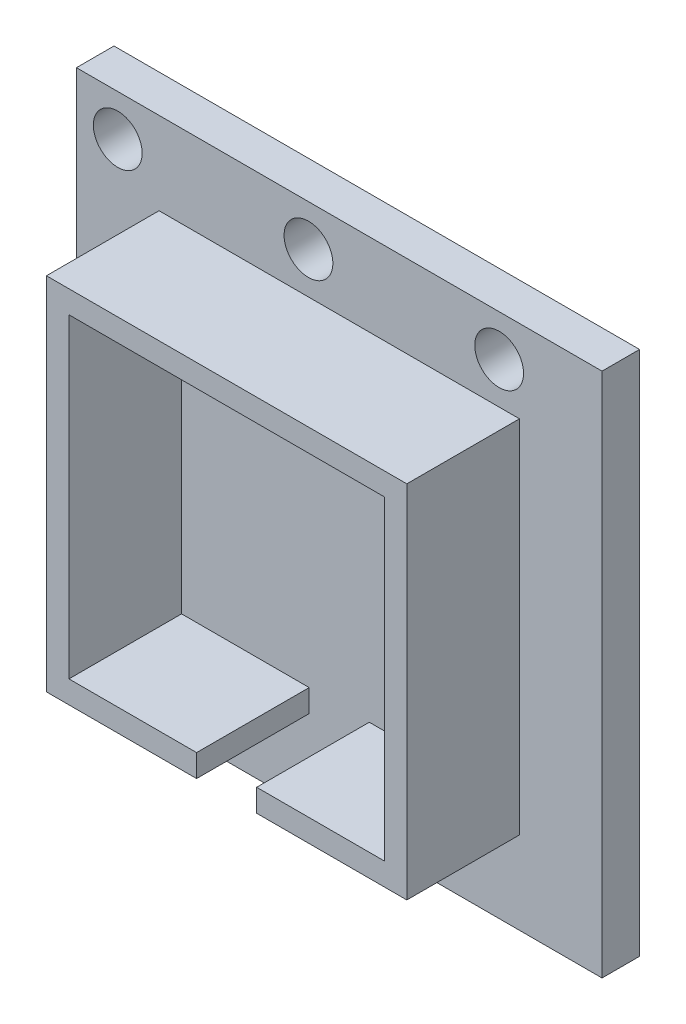
ISO-10303-21;
HEADER;
FILE_DESCRIPTION(('STEP AP214'),'2;1');
FILE_NAME('part.step','',(''),(''),'','','');
FILE_SCHEMA(('AUTOMOTIVE_DESIGN { 1 0 10303 214 1 1 1 1 }'));
ENDSEC;
DATA;
#1=APPLICATION_CONTEXT('core data for automotive mechanical design processes');
#2=APPLICATION_PROTOCOL_DEFINITION('international standard','automotive_design',2000,#1);
#3=PRODUCT_CONTEXT('',#1,'mechanical');
#4=PRODUCT('Part','Part','',(#3));
#5=PRODUCT_RELATED_PRODUCT_CATEGORY('part','',(#4));
#6=PRODUCT_DEFINITION_FORMATION('','',#4);
#7=PRODUCT_DEFINITION_CONTEXT('part definition',#1,'design');
#8=PRODUCT_DEFINITION('design','',#6,#7);
#9=PRODUCT_DEFINITION_SHAPE('','',#8);
#10=(LENGTH_UNIT() NAMED_UNIT(*) SI_UNIT(.MILLI.,.METRE.));
#11=(NAMED_UNIT(*) PLANE_ANGLE_UNIT() SI_UNIT($,.RADIAN.));
#12=(NAMED_UNIT(*) SI_UNIT($,.STERADIAN.) SOLID_ANGLE_UNIT());
#13=UNCERTAINTY_MEASURE_WITH_UNIT(LENGTH_MEASURE(1.E-05),#10,'distance_accuracy_value','');
#14=(GEOMETRIC_REPRESENTATION_CONTEXT(3) GLOBAL_UNCERTAINTY_ASSIGNED_CONTEXT((#13)) GLOBAL_UNIT_ASSIGNED_CONTEXT((#10,
#11,#12)) REPRESENTATION_CONTEXT('',''));
#15=CARTESIAN_POINT('',(0.,0.,0.));
#16=DIRECTION('',(0.,0.,1.));
#17=DIRECTION('',(1.,0.,0.));
#18=AXIS2_PLACEMENT_3D('',#15,#16,#17);
#19=CARTESIAN_POINT('',(11.,11.,20.));
#20=DIRECTION('',(0.,1.,0.));
#21=DIRECTION('',(0.,0.,1.));
#22=AXIS2_PLACEMENT_3D('',#19,#20,#21);
#23=PLANE('',#22);
#24=DIRECTION('',(1.,0.,0.));
#25=VECTOR('',#24,1.);
#26=CARTESIAN_POINT('',(11.,11.,5.));
#27=LINE('',#26,#25);
#28=CARTESIAN_POINT('',(11.,11.,5.));
#29=VERTEX_POINT('',#28);
#30=CARTESIAN_POINT('',(31.,11.,5.));
#31=VERTEX_POINT('',#30);
#32=EDGE_CURVE('E61',#29,#31,#27,.T.);
#33=ORIENTED_EDGE('',*,*,#32,.T.);
#34=DIRECTION('',(0.,0.,1.));
#35=VECTOR('',#34,1.);
#36=CARTESIAN_POINT('',(31.,11.,20.));
#37=LINE('',#36,#35);
#38=CARTESIAN_POINT('',(31.,11.,20.));
#39=VERTEX_POINT('',#38);
#40=EDGE_CURVE('E468',#31,#39,#37,.T.);
#41=ORIENTED_EDGE('',*,*,#40,.T.);
#42=DIRECTION('',(1.,0.,0.));
#43=VECTOR('',#42,1.);
#44=CARTESIAN_POINT('',(11.,11.,20.));
#45=LINE('',#44,#43);
#46=CARTESIAN_POINT('',(11.,11.,20.));
#47=VERTEX_POINT('',#46);
#48=EDGE_CURVE('E176',#47,#39,#45,.T.);
#49=ORIENTED_EDGE('',*,*,#48,.F.);
#50=DIRECTION('',(0.,0.,-1.));
#51=VECTOR('',#50,1.);
#52=CARTESIAN_POINT('',(11.,11.,20.));
#53=LINE('',#52,#51);
#54=EDGE_CURVE('E206',#47,#29,#53,.T.);
#55=ORIENTED_EDGE('',*,*,#54,.T.);
#56=EDGE_LOOP('',(#33,#41,#49,#55));
#57=FACE_BOUND('',#56,.T.);
#58=ADVANCED_FACE('F39',(#57),#23,.F.);
#59=CARTESIAN_POINT('',(14.,14.,20.));
#60=DIRECTION('',(0.,1.,0.));
#61=DIRECTION('',(0.,0.,1.));
#62=AXIS2_PLACEMENT_3D('',#59,#60,#61);
#63=PLANE('',#62);
#64=DIRECTION('',(0.,0.,1.));
#65=VECTOR('',#64,1.);
#66=CARTESIAN_POINT('',(31.,14.,20.));
#67=LINE('',#66,#65);
#68=CARTESIAN_POINT('',(31.,14.,5.));
#69=VERTEX_POINT('',#68);
#70=CARTESIAN_POINT('',(31.,14.,20.));
#71=VERTEX_POINT('',#70);
#72=EDGE_CURVE('E158',#69,#71,#67,.T.);
#73=ORIENTED_EDGE('',*,*,#72,.F.);
#74=DIRECTION('',(1.,0.,0.));
#75=VECTOR('',#74,1.);
#76=CARTESIAN_POINT('',(14.,14.,5.));
#77=LINE('',#76,#75);
#78=CARTESIAN_POINT('',(14.,14.,5.));
#79=VERTEX_POINT('',#78);
#80=EDGE_CURVE('E446',#79,#69,#77,.T.);
#81=ORIENTED_EDGE('',*,*,#80,.F.);
#82=DIRECTION('',(0.,0.,-1.));
#83=VECTOR('',#82,1.);
#84=CARTESIAN_POINT('',(14.,14.,20.));
#85=LINE('',#84,#83);
#86=CARTESIAN_POINT('',(14.,14.,20.));
#87=VERTEX_POINT('',#86);
#88=EDGE_CURVE('E193',#87,#79,#85,.T.);
#89=ORIENTED_EDGE('',*,*,#88,.F.);
#90=DIRECTION('',(1.,0.,0.));
#91=VECTOR('',#90,1.);
#92=CARTESIAN_POINT('',(14.,14.,20.));
#93=LINE('',#92,#91);
#94=EDGE_CURVE('E434',#87,#71,#93,.T.);
#95=ORIENTED_EDGE('',*,*,#94,.T.);
#96=EDGE_LOOP('',(#73,#81,#89,#95));
#97=FACE_BOUND('',#96,.T.);
#98=ADVANCED_FACE('F259',(#97),#63,.T.);
#99=CARTESIAN_POINT('',(0.,0.,5.));
#100=DIRECTION('',(1.,0.,0.));
#101=DIRECTION('',(0.,1.,0.));
#102=AXIS2_PLACEMENT_3D('',#99,#100,#101);
#103=PLANE('',#102);
#104=DIRECTION('',(0.,-1.,0.));
#105=VECTOR('',#104,1.);
#106=CARTESIAN_POINT('',(0.,0.,0.));
#107=LINE('',#106,#105);
#108=CARTESIAN_POINT('',(0.,70.,0.));
#109=VERTEX_POINT('',#108);
#110=CARTESIAN_POINT('',(0.,0.,0.));
#111=VERTEX_POINT('',#110);
#112=EDGE_CURVE('E208',#109,#111,#107,.T.);
#113=ORIENTED_EDGE('',*,*,#112,.T.);
#114=DIRECTION('',(0.,0.,-1.));
#115=VECTOR('',#114,1.);
#116=CARTESIAN_POINT('',(0.,0.,5.));
#117=LINE('',#116,#115);
#118=CARTESIAN_POINT('',(0.,0.,5.));
#119=VERTEX_POINT('',#118);
#120=EDGE_CURVE('E11',#119,#111,#117,.T.);
#121=ORIENTED_EDGE('',*,*,#120,.F.);
#122=DIRECTION('',(0.,-1.,0.));
#123=VECTOR('',#122,1.);
#124=CARTESIAN_POINT('',(0.,0.,5.));
#125=LINE('',#124,#123);
#126=CARTESIAN_POINT('',(0.,70.,5.));
#127=VERTEX_POINT('',#126);
#128=EDGE_CURVE('E217',#127,#119,#125,.T.);
#129=ORIENTED_EDGE('',*,*,#128,.F.);
#130=DIRECTION('',(0.,0.,-1.));
#131=VECTOR('',#130,1.);
#132=CARTESIAN_POINT('',(0.,70.,5.));
#133=LINE('',#132,#131);
#134=EDGE_CURVE('E226',#127,#109,#133,.T.);
#135=ORIENTED_EDGE('',*,*,#134,.T.);
#136=EDGE_LOOP('',(#113,#121,#129,#135));
#137=FACE_BOUND('',#136,.T.);
#138=ADVANCED_FACE('F41',(#137),#103,.F.);
#139=CARTESIAN_POINT('',(0.,0.,5.));
#140=DIRECTION('',(0.,1.,0.));
#141=DIRECTION('',(0.,0.,1.));
#142=AXIS2_PLACEMENT_3D('',#139,#140,#141);
#143=PLANE('',#142);
#144=DIRECTION('',(1.,0.,0.));
#145=VECTOR('',#144,1.);
#146=CARTESIAN_POINT('',(0.,0.,0.));
#147=LINE('',#146,#145);
#148=CARTESIAN_POINT('',(70.,0.,0.));
#149=VERTEX_POINT('',#148);
#150=EDGE_CURVE('E211',#111,#149,#147,.T.);
#151=ORIENTED_EDGE('',*,*,#150,.T.);
#152=DIRECTION('',(0.,0.,-1.));
#153=VECTOR('',#152,1.);
#154=CARTESIAN_POINT('',(70.,0.,5.));
#155=LINE('',#154,#153);
#156=CARTESIAN_POINT('',(70.,0.,5.));
#157=VERTEX_POINT('',#156);
#158=EDGE_CURVE('E47',#157,#149,#155,.T.);
#159=ORIENTED_EDGE('',*,*,#158,.F.);
#160=DIRECTION('',(1.,0.,0.));
#161=VECTOR('',#160,1.);
#162=CARTESIAN_POINT('',(0.,0.,5.));
#163=LINE('',#162,#161);
#164=EDGE_CURVE('E220',#119,#157,#163,.T.);
#165=ORIENTED_EDGE('',*,*,#164,.F.);
#166=ORIENTED_EDGE('',*,*,#120,.T.);
#167=EDGE_LOOP('',(#151,#159,#165,#166));
#168=FACE_BOUND('',#167,.T.);
#169=ADVANCED_FACE('F252',(#168),#143,.F.);
#170=CARTESIAN_POINT('',(70.,0.,5.));
#171=DIRECTION('',(-1.,0.,0.));
#172=DIRECTION('',(0.,-1.,0.));
#173=AXIS2_PLACEMENT_3D('',#170,#171,#172);
#174=PLANE('',#173);
#175=DIRECTION('',(0.,1.,0.));
#176=VECTOR('',#175,1.);
#177=CARTESIAN_POINT('',(70.,0.,0.));
#178=LINE('',#177,#176);
#179=CARTESIAN_POINT('',(70.,70.,0.));
#180=VERTEX_POINT('',#179);
#181=EDGE_CURVE('E213',#149,#180,#178,.T.);
#182=ORIENTED_EDGE('',*,*,#181,.T.);
#183=DIRECTION('',(0.,0.,-1.));
#184=VECTOR('',#183,1.);
#185=CARTESIAN_POINT('',(70.,70.,5.));
#186=LINE('',#185,#184);
#187=CARTESIAN_POINT('',(70.,70.,5.));
#188=VERTEX_POINT('',#187);
#189=EDGE_CURVE('E229',#188,#180,#186,.T.);
#190=ORIENTED_EDGE('',*,*,#189,.F.);
#191=DIRECTION('',(0.,1.,0.));
#192=VECTOR('',#191,1.);
#193=CARTESIAN_POINT('',(70.,0.,5.));
#194=LINE('',#193,#192);
#195=EDGE_CURVE('E222',#157,#188,#194,.T.);
#196=ORIENTED_EDGE('',*,*,#195,.F.);
#197=ORIENTED_EDGE('',*,*,#158,.T.);
#198=EDGE_LOOP('',(#182,#190,#196,#197));
#199=FACE_BOUND('',#198,.T.);
#200=ADVANCED_FACE('F236',(#199),#174,.F.);
#201=CARTESIAN_POINT('',(0.,70.,5.));
#202=DIRECTION('',(0.,-1.,0.));
#203=DIRECTION('',(0.,0.,-1.));
#204=AXIS2_PLACEMENT_3D('',#201,#202,#203);
#205=PLANE('',#204);
#206=DIRECTION('',(-1.,0.,0.));
#207=VECTOR('',#206,1.);
#208=CARTESIAN_POINT('',(0.,70.,0.));
#209=LINE('',#208,#207);
#210=EDGE_CURVE('E215',#180,#109,#209,.T.);
#211=ORIENTED_EDGE('',*,*,#210,.T.);
#212=ORIENTED_EDGE('',*,*,#134,.F.);
#213=DIRECTION('',(-1.,0.,0.));
#214=VECTOR('',#213,1.);
#215=CARTESIAN_POINT('',(0.,70.,5.));
#216=LINE('',#215,#214);
#217=EDGE_CURVE('E224',#188,#127,#216,.T.);
#218=ORIENTED_EDGE('',*,*,#217,.F.);
#219=ORIENTED_EDGE('',*,*,#189,.T.);
#220=EDGE_LOOP('',(#211,#212,#218,#219));
#221=FACE_BOUND('',#220,.T.);
#222=ADVANCED_FACE('F245',(#221),#205,.F.);
#223=CARTESIAN_POINT('',(0.,70.,0.));
#224=DIRECTION('',(0.,0.,-1.));
#225=DIRECTION('',(-1.,0.,0.));
#226=AXIS2_PLACEMENT_3D('',#223,#224,#225);
#227=PLANE('',#226);
#228=CARTESIAN_POINT('',(5.49999999999998,13.7,0.));
#229=DIRECTION('',(0.,0.,1.));
#230=DIRECTION('',(1.,0.,0.));
#231=AXIS2_PLACEMENT_3D('',#228,#229,#230);
#232=CIRCLE('',#231,3.25);
#233=CARTESIAN_POINT('',(8.74999999999998,13.7,0.));
#234=VERTEX_POINT('',#233);
#235=EDGE_CURVE('E474',#234,#234,#232,.T.);
#236=ORIENTED_EDGE('',*,*,#235,.T.);
#237=EDGE_LOOP('',(#236));
#238=FACE_BOUND('',#237,.T.);
#239=CARTESIAN_POINT('',(5.49999999999998,39.1,0.));
#240=DIRECTION('',(0.,0.,1.));
#241=DIRECTION('',(1.,0.,0.));
#242=AXIS2_PLACEMENT_3D('',#239,#240,#241);
#243=CIRCLE('',#242,3.25);
#244=CARTESIAN_POINT('',(8.74999999999998,39.1,0.));
#245=VERTEX_POINT('',#244);
#246=EDGE_CURVE('E478',#245,#245,#243,.T.);
#247=ORIENTED_EDGE('',*,*,#246,.T.);
#248=EDGE_LOOP('',(#247));
#249=FACE_BOUND('',#248,.T.);
#250=CARTESIAN_POINT('',(56.3,64.5,0.));
#251=DIRECTION('',(0.,0.,1.));
#252=DIRECTION('',(1.,0.,0.));
#253=AXIS2_PLACEMENT_3D('',#250,#251,#252);
#254=CIRCLE('',#253,3.25);
#255=CARTESIAN_POINT('',(59.55,64.5,0.));
#256=VERTEX_POINT('',#255);
#257=EDGE_CURVE('E482',#256,#256,#254,.T.);
#258=ORIENTED_EDGE('',*,*,#257,.T.);
#259=EDGE_LOOP('',(#258));
#260=FACE_BOUND('',#259,.T.);
#261=CARTESIAN_POINT('',(30.9,64.5,0.));
#262=DIRECTION('',(0.,0.,1.));
#263=DIRECTION('',(1.,0.,0.));
#264=AXIS2_PLACEMENT_3D('',#261,#262,#263);
#265=CIRCLE('',#264,3.25);
#266=CARTESIAN_POINT('',(34.15,64.5,0.));
#267=VERTEX_POINT('',#266);
#268=EDGE_CURVE('E422',#267,#267,#265,.T.);
#269=ORIENTED_EDGE('',*,*,#268,.T.);
#270=EDGE_LOOP('',(#269));
#271=FACE_BOUND('',#270,.T.);
#272=CARTESIAN_POINT('',(5.49999999999998,64.5,0.));
#273=DIRECTION('',(0.,0.,1.));
#274=DIRECTION('',(1.,0.,0.));
#275=AXIS2_PLACEMENT_3D('',#272,#273,#274);
#276=CIRCLE('',#275,3.25);
#277=CARTESIAN_POINT('',(8.74999999999998,64.5,0.));
#278=VERTEX_POINT('',#277);
#279=EDGE_CURVE('E421',#278,#278,#276,.T.);
#280=ORIENTED_EDGE('',*,*,#279,.T.);
#281=EDGE_LOOP('',(#280));
#282=FACE_BOUND('',#281,.T.);
#283=ORIENTED_EDGE('',*,*,#112,.F.);
#284=ORIENTED_EDGE('',*,*,#210,.F.);
#285=ORIENTED_EDGE('',*,*,#181,.F.);
#286=ORIENTED_EDGE('',*,*,#150,.F.);
#287=EDGE_LOOP('',(#283,#284,#285,#286));
#288=FACE_BOUND('',#287,.T.);
#289=ADVANCED_FACE('F242',(#238,#249,#260,#271,#282,#288),#227,.T.);
#290=CARTESIAN_POINT('',(11.,59.,20.));
#291=DIRECTION('',(0.,0.,-1.));
#292=DIRECTION('',(-1.,0.,0.));
#293=AXIS2_PLACEMENT_3D('',#290,#291,#292);
#294=PLANE('',#293);
#295=ORIENTED_EDGE('',*,*,#48,.T.);
#296=DIRECTION('',(0.,-1.,0.));
#297=VECTOR('',#296,1.);
#298=CARTESIAN_POINT('',(31.,18.,20.));
#299=LINE('',#298,#297);
#300=EDGE_CURVE('E170',#71,#39,#299,.T.);
#301=ORIENTED_EDGE('',*,*,#300,.F.);
#302=ORIENTED_EDGE('',*,*,#94,.F.);
#303=DIRECTION('',(0.,-1.,0.));
#304=VECTOR('',#303,1.);
#305=CARTESIAN_POINT('',(14.,56.,20.));
#306=LINE('',#305,#304);
#307=CARTESIAN_POINT('',(14.,56.,20.));
#308=VERTEX_POINT('',#307);
#309=EDGE_CURVE('E431',#308,#87,#306,.T.);
#310=ORIENTED_EDGE('',*,*,#309,.F.);
#311=DIRECTION('',(-1.,0.,0.));
#312=VECTOR('',#311,1.);
#313=CARTESIAN_POINT('',(14.,56.,20.));
#314=LINE('',#313,#312);
#315=CARTESIAN_POINT('',(56.,56.,20.));
#316=VERTEX_POINT('',#315);
#317=EDGE_CURVE('E440',#316,#308,#314,.T.);
#318=ORIENTED_EDGE('',*,*,#317,.F.);
#319=DIRECTION('',(0.,1.,0.));
#320=VECTOR('',#319,1.);
#321=CARTESIAN_POINT('',(56.,56.,20.));
#322=LINE('',#321,#320);
#323=CARTESIAN_POINT('',(56.,14.,20.));
#324=VERTEX_POINT('',#323);
#325=EDGE_CURVE('E437',#324,#316,#322,.T.);
#326=ORIENTED_EDGE('',*,*,#325,.F.);
#327=CARTESIAN_POINT('',(39.,14.,20.));
#328=VERTEX_POINT('',#327);
#329=EDGE_CURVE('E168',#328,#324,#93,.T.);
#330=ORIENTED_EDGE('',*,*,#329,.F.);
#331=DIRECTION('',(0.,1.,0.));
#332=VECTOR('',#331,1.);
#333=CARTESIAN_POINT('',(39.,18.,20.));
#334=LINE('',#333,#332);
#335=CARTESIAN_POINT('',(39.,11.,20.));
#336=VERTEX_POINT('',#335);
#337=EDGE_CURVE('E154',#336,#328,#334,.T.);
#338=ORIENTED_EDGE('',*,*,#337,.F.);
#339=CARTESIAN_POINT('',(59.,11.,20.));
#340=VERTEX_POINT('',#339);
#341=EDGE_CURVE('E165',#336,#340,#45,.T.);
#342=ORIENTED_EDGE('',*,*,#341,.T.);
#343=DIRECTION('',(0.,1.,0.));
#344=VECTOR('',#343,1.);
#345=CARTESIAN_POINT('',(59.,11.,20.));
#346=LINE('',#345,#344);
#347=CARTESIAN_POINT('',(59.,59.,20.));
#348=VERTEX_POINT('',#347);
#349=EDGE_CURVE('E179',#340,#348,#346,.T.);
#350=ORIENTED_EDGE('',*,*,#349,.T.);
#351=DIRECTION('',(-1.,0.,0.));
#352=VECTOR('',#351,1.);
#353=CARTESIAN_POINT('',(11.,59.,20.));
#354=LINE('',#353,#352);
#355=CARTESIAN_POINT('',(11.,59.,20.));
#356=VERTEX_POINT('',#355);
#357=EDGE_CURVE('E186',#348,#356,#354,.T.);
#358=ORIENTED_EDGE('',*,*,#357,.T.);
#359=DIRECTION('',(0.,-1.,0.));
#360=VECTOR('',#359,1.);
#361=CARTESIAN_POINT('',(11.,11.,20.));
#362=LINE('',#361,#360);
#363=EDGE_CURVE('E177',#356,#47,#362,.T.);
#364=ORIENTED_EDGE('',*,*,#363,.T.);
#365=EDGE_LOOP('',(#295,#301,#302,#310,#318,#326,#330,#338,#342,#350,#358,#364));
#366=FACE_BOUND('',#365,.T.);
#367=ADVANCED_FACE('F164',(#366),#294,.F.);
#368=CARTESIAN_POINT('',(11.,11.,20.));
#369=DIRECTION('',(1.,0.,0.));
#370=DIRECTION('',(0.,0.,-1.));
#371=AXIS2_PLACEMENT_3D('',#368,#369,#370);
#372=PLANE('',#371);
#373=DIRECTION('',(0.,-1.,0.));
#374=VECTOR('',#373,1.);
#375=CARTESIAN_POINT('',(11.,11.,5.));
#376=LINE('',#375,#374);
#377=CARTESIAN_POINT('',(11.,59.,5.));
#378=VERTEX_POINT('',#377);
#379=EDGE_CURVE('E189',#378,#29,#376,.T.);
#380=ORIENTED_EDGE('',*,*,#379,.T.);
#381=ORIENTED_EDGE('',*,*,#54,.F.);
#382=ORIENTED_EDGE('',*,*,#363,.F.);
#383=DIRECTION('',(0.,0.,-1.));
#384=VECTOR('',#383,1.);
#385=CARTESIAN_POINT('',(11.,59.,20.));
#386=LINE('',#385,#384);
#387=EDGE_CURVE('E188',#356,#378,#386,.T.);
#388=ORIENTED_EDGE('',*,*,#387,.T.);
#389=EDGE_LOOP('',(#380,#381,#382,#388));
#390=FACE_BOUND('',#389,.T.);
#391=ADVANCED_FACE('F273',(#390),#372,.F.);
#392=ORIENTED_EDGE('',*,*,#341,.F.);
#393=DIRECTION('',(0.,0.,-1.));
#394=VECTOR('',#393,1.);
#395=CARTESIAN_POINT('',(39.,11.,20.));
#396=LINE('',#395,#394);
#397=CARTESIAN_POINT('',(39.,11.,5.));
#398=VERTEX_POINT('',#397);
#399=EDGE_CURVE('E151',#336,#398,#396,.T.);
#400=ORIENTED_EDGE('',*,*,#399,.T.);
#401=CARTESIAN_POINT('',(59.,11.,5.));
#402=VERTEX_POINT('',#401);
#403=EDGE_CURVE('E192',#398,#402,#27,.T.);
#404=ORIENTED_EDGE('',*,*,#403,.T.);
#405=DIRECTION('',(0.,0.,-1.));
#406=VECTOR('',#405,1.);
#407=CARTESIAN_POINT('',(59.,11.,20.));
#408=LINE('',#407,#406);
#409=EDGE_CURVE('E174',#340,#402,#408,.T.);
#410=ORIENTED_EDGE('',*,*,#409,.F.);
#411=EDGE_LOOP('',(#392,#400,#404,#410));
#412=FACE_BOUND('',#411,.T.);
#413=ADVANCED_FACE('F172',(#412),#23,.F.);
#414=CARTESIAN_POINT('',(59.,11.,20.));
#415=DIRECTION('',(-1.,0.,0.));
#416=DIRECTION('',(0.,0.,1.));
#417=AXIS2_PLACEMENT_3D('',#414,#415,#416);
#418=PLANE('',#417);
#419=DIRECTION('',(0.,1.,0.));
#420=VECTOR('',#419,1.);
#421=CARTESIAN_POINT('',(59.,11.,5.));
#422=LINE('',#421,#420);
#423=CARTESIAN_POINT('',(59.,59.,5.));
#424=VERTEX_POINT('',#423);
#425=EDGE_CURVE('E195',#402,#424,#422,.T.);
#426=ORIENTED_EDGE('',*,*,#425,.T.);
#427=DIRECTION('',(0.,0.,-1.));
#428=VECTOR('',#427,1.);
#429=CARTESIAN_POINT('',(59.,59.,20.));
#430=LINE('',#429,#428);
#431=EDGE_CURVE('E202',#348,#424,#430,.T.);
#432=ORIENTED_EDGE('',*,*,#431,.F.);
#433=ORIENTED_EDGE('',*,*,#349,.F.);
#434=ORIENTED_EDGE('',*,*,#409,.T.);
#435=EDGE_LOOP('',(#426,#432,#433,#434));
#436=FACE_BOUND('',#435,.T.);
#437=ADVANCED_FACE('F272',(#436),#418,.F.);
#438=CARTESIAN_POINT('',(11.,59.,20.));
#439=DIRECTION('',(0.,-1.,0.));
#440=DIRECTION('',(0.,0.,-1.));
#441=AXIS2_PLACEMENT_3D('',#438,#439,#440);
#442=PLANE('',#441);
#443=DIRECTION('',(-1.,0.,0.));
#444=VECTOR('',#443,1.);
#445=CARTESIAN_POINT('',(11.,59.,5.));
#446=LINE('',#445,#444);
#447=EDGE_CURVE('E181',#424,#378,#446,.T.);
#448=ORIENTED_EDGE('',*,*,#447,.T.);
#449=ORIENTED_EDGE('',*,*,#387,.F.);
#450=ORIENTED_EDGE('',*,*,#357,.F.);
#451=ORIENTED_EDGE('',*,*,#431,.T.);
#452=EDGE_LOOP('',(#448,#449,#450,#451));
#453=FACE_BOUND('',#452,.T.);
#454=ADVANCED_FACE('F278',(#453),#442,.F.);
#455=CARTESIAN_POINT('',(14.,56.,20.));
#456=DIRECTION('',(1.,0.,0.));
#457=DIRECTION('',(0.,1.,0.));
#458=AXIS2_PLACEMENT_3D('',#455,#456,#457);
#459=PLANE('',#458);
#460=DIRECTION('',(0.,-1.,0.));
#461=VECTOR('',#460,1.);
#462=CARTESIAN_POINT('',(14.,56.,5.));
#463=LINE('',#462,#461);
#464=CARTESIAN_POINT('',(14.,56.,5.));
#465=VERTEX_POINT('',#464);
#466=EDGE_CURVE('E425',#465,#79,#463,.T.);
#467=ORIENTED_EDGE('',*,*,#466,.F.);
#468=DIRECTION('',(0.,0.,-1.));
#469=VECTOR('',#468,1.);
#470=CARTESIAN_POINT('',(14.,56.,20.));
#471=LINE('',#470,#469);
#472=EDGE_CURVE('E442',#308,#465,#471,.T.);
#473=ORIENTED_EDGE('',*,*,#472,.F.);
#474=ORIENTED_EDGE('',*,*,#309,.T.);
#475=ORIENTED_EDGE('',*,*,#88,.T.);
#476=EDGE_LOOP('',(#467,#473,#474,#475));
#477=FACE_BOUND('',#476,.T.);
#478=ADVANCED_FACE('F327',(#477),#459,.T.);
#479=DIRECTION('',(0.,0.,-1.));
#480=VECTOR('',#479,1.);
#481=CARTESIAN_POINT('',(39.,14.,20.));
#482=LINE('',#481,#480);
#483=CARTESIAN_POINT('',(39.,14.,5.));
#484=VERTEX_POINT('',#483);
#485=EDGE_CURVE('E159',#328,#484,#482,.T.);
#486=ORIENTED_EDGE('',*,*,#485,.F.);
#487=ORIENTED_EDGE('',*,*,#329,.T.);
#488=DIRECTION('',(0.,0.,-1.));
#489=VECTOR('',#488,1.);
#490=CARTESIAN_POINT('',(56.,14.,20.));
#491=LINE('',#490,#489);
#492=CARTESIAN_POINT('',(56.,14.,5.));
#493=VERTEX_POINT('',#492);
#494=EDGE_CURVE('E456',#324,#493,#491,.T.);
#495=ORIENTED_EDGE('',*,*,#494,.T.);
#496=EDGE_CURVE('E445',#484,#493,#77,.T.);
#497=ORIENTED_EDGE('',*,*,#496,.F.);
#498=EDGE_LOOP('',(#486,#487,#495,#497));
#499=FACE_BOUND('',#498,.T.);
#500=ADVANCED_FACE('F268',(#499),#63,.T.);
#501=CARTESIAN_POINT('',(56.,56.,20.));
#502=DIRECTION('',(-1.,0.,0.));
#503=DIRECTION('',(0.,-1.,0.));
#504=AXIS2_PLACEMENT_3D('',#501,#502,#503);
#505=PLANE('',#504);
#506=DIRECTION('',(0.,1.,0.));
#507=VECTOR('',#506,1.);
#508=CARTESIAN_POINT('',(56.,56.,5.));
#509=LINE('',#508,#507);
#510=CARTESIAN_POINT('',(56.,56.,5.));
#511=VERTEX_POINT('',#510);
#512=EDGE_CURVE('E448',#493,#511,#509,.T.);
#513=ORIENTED_EDGE('',*,*,#512,.F.);
#514=ORIENTED_EDGE('',*,*,#494,.F.);
#515=ORIENTED_EDGE('',*,*,#325,.T.);
#516=DIRECTION('',(0.,0.,-1.));
#517=VECTOR('',#516,1.);
#518=CARTESIAN_POINT('',(56.,56.,20.));
#519=LINE('',#518,#517);
#520=EDGE_CURVE('E454',#316,#511,#519,.T.);
#521=ORIENTED_EDGE('',*,*,#520,.T.);
#522=EDGE_LOOP('',(#513,#514,#515,#521));
#523=FACE_BOUND('',#522,.T.);
#524=ADVANCED_FACE('F326',(#523),#505,.T.);
#525=CARTESIAN_POINT('',(14.,56.,20.));
#526=DIRECTION('',(0.,-1.,0.));
#527=DIRECTION('',(0.,0.,-1.));
#528=AXIS2_PLACEMENT_3D('',#525,#526,#527);
#529=PLANE('',#528);
#530=DIRECTION('',(-1.,0.,0.));
#531=VECTOR('',#530,1.);
#532=CARTESIAN_POINT('',(14.,56.,5.));
#533=LINE('',#532,#531);
#534=EDGE_CURVE('E433',#511,#465,#533,.T.);
#535=ORIENTED_EDGE('',*,*,#534,.F.);
#536=ORIENTED_EDGE('',*,*,#520,.F.);
#537=ORIENTED_EDGE('',*,*,#317,.T.);
#538=ORIENTED_EDGE('',*,*,#472,.T.);
#539=EDGE_LOOP('',(#535,#536,#537,#538));
#540=FACE_BOUND('',#539,.T.);
#541=ADVANCED_FACE('F292',(#540),#529,.T.);
#542=CARTESIAN_POINT('',(0.,70.,5.));
#543=DIRECTION('',(0.,0.,-1.));
#544=DIRECTION('',(-1.,0.,0.));
#545=AXIS2_PLACEMENT_3D('',#542,#543,#544);
#546=PLANE('',#545);
#547=DIRECTION('',(0.,-1.,0.));
#548=VECTOR('',#547,1.);
#549=CARTESIAN_POINT('',(31.,18.,5.));
#550=LINE('',#549,#548);
#551=EDGE_CURVE('E169',#69,#31,#550,.T.);
#552=ORIENTED_EDGE('',*,*,#551,.T.);
#553=ORIENTED_EDGE('',*,*,#32,.F.);
#554=ORIENTED_EDGE('',*,*,#379,.F.);
#555=ORIENTED_EDGE('',*,*,#447,.F.);
#556=ORIENTED_EDGE('',*,*,#425,.F.);
#557=ORIENTED_EDGE('',*,*,#403,.F.);
#558=DIRECTION('',(0.,1.,0.));
#559=VECTOR('',#558,1.);
#560=CARTESIAN_POINT('',(39.,18.,5.));
#561=LINE('',#560,#559);
#562=EDGE_CURVE('E54',#398,#484,#561,.T.);
#563=ORIENTED_EDGE('',*,*,#562,.T.);
#564=ORIENTED_EDGE('',*,*,#496,.T.);
#565=ORIENTED_EDGE('',*,*,#512,.T.);
#566=ORIENTED_EDGE('',*,*,#534,.T.);
#567=ORIENTED_EDGE('',*,*,#466,.T.);
#568=ORIENTED_EDGE('',*,*,#80,.T.);
#569=EDGE_LOOP('',(#552,#553,#554,#555,#556,#557,#563,#564,#565,#566,#567,#568));
#570=FACE_BOUND('',#569,.T.);
#571=CARTESIAN_POINT('',(5.49999999999998,13.7,5.));
#572=DIRECTION('',(0.,0.,1.));
#573=DIRECTION('',(1.,0.,0.));
#574=AXIS2_PLACEMENT_3D('',#571,#572,#573);
#575=CIRCLE('',#574,3.25);
#576=CARTESIAN_POINT('',(8.74999999999998,13.7,5.));
#577=VERTEX_POINT('',#576);
#578=EDGE_CURVE('E404',#577,#577,#575,.T.);
#579=ORIENTED_EDGE('',*,*,#578,.F.);
#580=EDGE_LOOP('',(#579));
#581=FACE_BOUND('',#580,.T.);
#582=CARTESIAN_POINT('',(5.49999999999998,39.1,5.));
#583=DIRECTION('',(0.,0.,1.));
#584=DIRECTION('',(1.,0.,0.));
#585=AXIS2_PLACEMENT_3D('',#582,#583,#584);
#586=CIRCLE('',#585,3.25);
#587=CARTESIAN_POINT('',(8.74999999999998,39.1,5.));
#588=VERTEX_POINT('',#587);
#589=EDGE_CURVE('E408',#588,#588,#586,.T.);
#590=ORIENTED_EDGE('',*,*,#589,.F.);
#591=EDGE_LOOP('',(#590));
#592=FACE_BOUND('',#591,.T.);
#593=CARTESIAN_POINT('',(56.3,64.5,5.));
#594=DIRECTION('',(0.,0.,1.));
#595=DIRECTION('',(1.,0.,0.));
#596=AXIS2_PLACEMENT_3D('',#593,#594,#595);
#597=CIRCLE('',#596,3.25);
#598=CARTESIAN_POINT('',(59.55,64.5,5.));
#599=VERTEX_POINT('',#598);
#600=EDGE_CURVE('E412',#599,#599,#597,.T.);
#601=ORIENTED_EDGE('',*,*,#600,.F.);
#602=EDGE_LOOP('',(#601));
#603=FACE_BOUND('',#602,.T.);
#604=CARTESIAN_POINT('',(30.9,64.5,5.));
#605=DIRECTION('',(0.,0.,1.));
#606=DIRECTION('',(1.,0.,0.));
#607=AXIS2_PLACEMENT_3D('',#604,#605,#606);
#608=CIRCLE('',#607,3.25);
#609=CARTESIAN_POINT('',(34.15,64.5,5.));
#610=VERTEX_POINT('',#609);
#611=EDGE_CURVE('E416',#610,#610,#608,.T.);
#612=ORIENTED_EDGE('',*,*,#611,.F.);
#613=EDGE_LOOP('',(#612));
#614=FACE_BOUND('',#613,.T.);
#615=CARTESIAN_POINT('',(5.49999999999998,64.5,5.));
#616=DIRECTION('',(0.,0.,1.));
#617=DIRECTION('',(1.,0.,0.));
#618=AXIS2_PLACEMENT_3D('',#615,#616,#617);
#619=CIRCLE('',#618,3.25);
#620=CARTESIAN_POINT('',(8.74999999999998,64.5,5.));
#621=VERTEX_POINT('',#620);
#622=EDGE_CURVE('E419',#621,#621,#619,.T.);
#623=ORIENTED_EDGE('',*,*,#622,.F.);
#624=EDGE_LOOP('',(#623));
#625=FACE_BOUND('',#624,.T.);
#626=ORIENTED_EDGE('',*,*,#128,.T.);
#627=ORIENTED_EDGE('',*,*,#164,.T.);
#628=ORIENTED_EDGE('',*,*,#195,.T.);
#629=ORIENTED_EDGE('',*,*,#217,.T.);
#630=EDGE_LOOP('',(#626,#627,#628,#629));
#631=FACE_BOUND('',#630,.T.);
#632=ADVANCED_FACE('F251',(#570,#581,#592,#603,#614,#625,#631),#546,.F.);
#633=CARTESIAN_POINT('',(5.49999999999998,64.5,0.));
#634=DIRECTION('',(0.,0.,1.));
#635=DIRECTION('',(1.,0.,0.));
#636=AXIS2_PLACEMENT_3D('',#633,#634,#635);
#637=CYLINDRICAL_SURFACE('',#636,3.25);
#638=ORIENTED_EDGE('',*,*,#279,.F.);
#639=EDGE_LOOP('',(#638));
#640=FACE_BOUND('',#639,.T.);
#641=ORIENTED_EDGE('',*,*,#622,.T.);
#642=EDGE_LOOP('',(#641));
#643=FACE_BOUND('',#642,.T.);
#644=ADVANCED_FACE('F291',(#640,#643),#637,.F.);
#645=CARTESIAN_POINT('',(30.9,64.5,0.));
#646=DIRECTION('',(0.,0.,1.));
#647=DIRECTION('',(1.,0.,0.));
#648=AXIS2_PLACEMENT_3D('',#645,#646,#647);
#649=CYLINDRICAL_SURFACE('',#648,3.25);
#650=ORIENTED_EDGE('',*,*,#268,.F.);
#651=EDGE_LOOP('',(#650));
#652=FACE_BOUND('',#651,.T.);
#653=ORIENTED_EDGE('',*,*,#611,.T.);
#654=EDGE_LOOP('',(#653));
#655=FACE_BOUND('',#654,.T.);
#656=ADVANCED_FACE('F375',(#652,#655),#649,.F.);
#657=CARTESIAN_POINT('',(56.3,64.5,0.));
#658=DIRECTION('',(0.,0.,1.));
#659=DIRECTION('',(1.,0.,0.));
#660=AXIS2_PLACEMENT_3D('',#657,#658,#659);
#661=CYLINDRICAL_SURFACE('',#660,3.25);
#662=ORIENTED_EDGE('',*,*,#257,.F.);
#663=EDGE_LOOP('',(#662));
#664=FACE_BOUND('',#663,.T.);
#665=ORIENTED_EDGE('',*,*,#600,.T.);
#666=EDGE_LOOP('',(#665));
#667=FACE_BOUND('',#666,.T.);
#668=ADVANCED_FACE('F371',(#664,#667),#661,.F.);
#669=CARTESIAN_POINT('',(5.49999999999998,39.1,0.));
#670=DIRECTION('',(0.,0.,1.));
#671=DIRECTION('',(1.,0.,0.));
#672=AXIS2_PLACEMENT_3D('',#669,#670,#671);
#673=CYLINDRICAL_SURFACE('',#672,3.25);
#674=ORIENTED_EDGE('',*,*,#246,.F.);
#675=EDGE_LOOP('',(#674));
#676=FACE_BOUND('',#675,.T.);
#677=ORIENTED_EDGE('',*,*,#589,.T.);
#678=EDGE_LOOP('',(#677));
#679=FACE_BOUND('',#678,.T.);
#680=ADVANCED_FACE('F367',(#676,#679),#673,.F.);
#681=CARTESIAN_POINT('',(5.49999999999998,13.7,0.));
#682=DIRECTION('',(0.,0.,1.));
#683=DIRECTION('',(1.,0.,0.));
#684=AXIS2_PLACEMENT_3D('',#681,#682,#683);
#685=CYLINDRICAL_SURFACE('',#684,3.25);
#686=ORIENTED_EDGE('',*,*,#235,.F.);
#687=EDGE_LOOP('',(#686));
#688=FACE_BOUND('',#687,.T.);
#689=ORIENTED_EDGE('',*,*,#578,.T.);
#690=EDGE_LOOP('',(#689));
#691=FACE_BOUND('',#690,.T.);
#692=ADVANCED_FACE('F351',(#688,#691),#685,.F.);
#693=CARTESIAN_POINT('',(31.,18.,5.));
#694=DIRECTION('',(-1.,0.,0.));
#695=DIRECTION('',(0.,-1.,0.));
#696=AXIS2_PLACEMENT_3D('',#693,#694,#695);
#697=PLANE('',#696);
#698=ORIENTED_EDGE('',*,*,#551,.F.);
#699=ORIENTED_EDGE('',*,*,#72,.T.);
#700=ORIENTED_EDGE('',*,*,#300,.T.);
#701=ORIENTED_EDGE('',*,*,#40,.F.);
#702=EDGE_LOOP('',(#698,#699,#700,#701));
#703=FACE_BOUND('',#702,.T.);
#704=ADVANCED_FACE('F347',(#703),#697,.F.);
#705=CARTESIAN_POINT('',(39.,18.,5.));
#706=DIRECTION('',(1.,0.,0.));
#707=DIRECTION('',(0.,0.,-1.));
#708=AXIS2_PLACEMENT_3D('',#705,#706,#707);
#709=PLANE('',#708);
#710=ORIENTED_EDGE('',*,*,#337,.T.);
#711=ORIENTED_EDGE('',*,*,#485,.T.);
#712=ORIENTED_EDGE('',*,*,#562,.F.);
#713=ORIENTED_EDGE('',*,*,#399,.F.);
#714=EDGE_LOOP('',(#710,#711,#712,#713));
#715=FACE_BOUND('',#714,.T.);
#716=ADVANCED_FACE('F153',(#715),#709,.F.);
#717=CLOSED_SHELL('',(#58,#98,#138,#169,#200,#222,#289,#367,#391,#413,#437,#454,#478,#500,#524,
#541,#632,#644,#656,#668,#680,#692,#704,#716));
#718=MANIFOLD_SOLID_BREP('B2',#717);
#719=ADVANCED_BREP_SHAPE_REPRESENTATION('',(#18,#718),#14);
#720=SHAPE_DEFINITION_REPRESENTATION(#9,#719);
ENDSEC;
END-ISO-10303-21;
